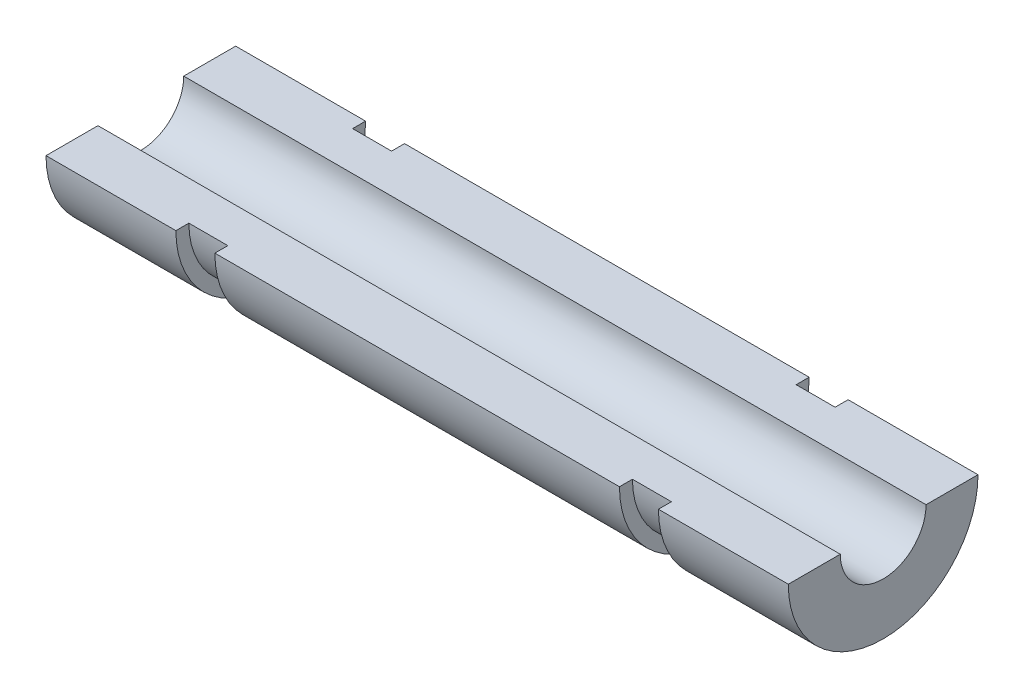
ISO-10303-21;
HEADER;
FILE_DESCRIPTION(('STEP AP214'),'2;1');
FILE_NAME('part.step','',(''),(''),'','','');
FILE_SCHEMA(('AUTOMOTIVE_DESIGN { 1 0 10303 214 1 1 1 1 }'));
ENDSEC;
DATA;
#1=APPLICATION_CONTEXT('core data for automotive mechanical design processes');
#2=APPLICATION_PROTOCOL_DEFINITION('international standard','automotive_design',2000,#1);
#3=PRODUCT_CONTEXT('',#1,'mechanical');
#4=PRODUCT('Part','Part','',(#3));
#5=PRODUCT_RELATED_PRODUCT_CATEGORY('part','',(#4));
#6=PRODUCT_DEFINITION_FORMATION('','',#4);
#7=PRODUCT_DEFINITION_CONTEXT('part definition',#1,'design');
#8=PRODUCT_DEFINITION('design','',#6,#7);
#9=PRODUCT_DEFINITION_SHAPE('','',#8);
#10=(LENGTH_UNIT() NAMED_UNIT(*) SI_UNIT(.MILLI.,.METRE.));
#11=(NAMED_UNIT(*) PLANE_ANGLE_UNIT() SI_UNIT($,.RADIAN.));
#12=(NAMED_UNIT(*) SI_UNIT($,.STERADIAN.) SOLID_ANGLE_UNIT());
#13=UNCERTAINTY_MEASURE_WITH_UNIT(LENGTH_MEASURE(1.E-05),#10,'distance_accuracy_value','');
#14=(GEOMETRIC_REPRESENTATION_CONTEXT(3) GLOBAL_UNCERTAINTY_ASSIGNED_CONTEXT((#13)) GLOBAL_UNIT_ASSIGNED_CONTEXT((#10,
#11,#12)) REPRESENTATION_CONTEXT('',''));
#15=CARTESIAN_POINT('',(0.,0.,0.));
#16=DIRECTION('',(0.,0.,1.));
#17=DIRECTION('',(1.,0.,0.));
#18=AXIS2_PLACEMENT_3D('',#15,#16,#17);
#19=CARTESIAN_POINT('',(-28.575,0.,-7.302));
#20=DIRECTION('',(-1.,0.,0.));
#21=DIRECTION('',(0.,0.,1.));
#22=AXIS2_PLACEMENT_3D('',#19,#20,#21);
#23=PLANE('',#22);
#24=CARTESIAN_POINT('',(-28.575,0.,0.));
#25=DIRECTION('',(-1.,0.,0.));
#26=DIRECTION('',(0.,0.,1.));
#27=AXIS2_PLACEMENT_3D('',#24,#25,#26);
#28=CIRCLE('',#27,3.302);
#29=CARTESIAN_POINT('',(-28.575,0.,-3.302));
#30=VERTEX_POINT('',#29);
#31=CARTESIAN_POINT('',(-28.575,0.,3.302));
#32=VERTEX_POINT('',#31);
#33=EDGE_CURVE('E11',#30,#32,#28,.T.);
#34=ORIENTED_EDGE('',*,*,#33,.F.);
#35=DIRECTION('',(0.,0.,-1.));
#36=VECTOR('',#35,1.);
#37=CARTESIAN_POINT('',(-28.575,0.,-7.302));
#38=LINE('',#37,#36);
#39=CARTESIAN_POINT('',(-28.575,0.,-7.302));
#40=VERTEX_POINT('',#39);
#41=EDGE_CURVE('E129',#30,#40,#38,.T.);
#42=ORIENTED_EDGE('',*,*,#41,.T.);
#43=CARTESIAN_POINT('',(-28.575,0.,0.));
#44=DIRECTION('',(-1.,0.,0.));
#45=DIRECTION('',(0.,0.,1.));
#46=AXIS2_PLACEMENT_3D('',#43,#44,#45);
#47=CIRCLE('',#46,7.302);
#48=CARTESIAN_POINT('',(-28.575,0.,7.302));
#49=VERTEX_POINT('',#48);
#50=EDGE_CURVE('E124',#40,#49,#47,.T.);
#51=ORIENTED_EDGE('',*,*,#50,.T.);
#52=DIRECTION('',(0.,0.,1.));
#53=VECTOR('',#52,1.);
#54=CARTESIAN_POINT('',(-28.575,0.,7.302));
#55=LINE('',#54,#53);
#56=EDGE_CURVE('E127',#32,#49,#55,.T.);
#57=ORIENTED_EDGE('',*,*,#56,.F.);
#58=EDGE_LOOP('',(#34,#42,#51,#57));
#59=FACE_BOUND('',#58,.T.);
#60=ADVANCED_FACE('F39',(#59),#23,.T.);
#61=CARTESIAN_POINT('',(-28.575,0.,0.));
#62=DIRECTION('',(-1.,0.,0.));
#63=DIRECTION('',(0.,0.,1.));
#64=AXIS2_PLACEMENT_3D('',#61,#62,#63);
#65=CYLINDRICAL_SURFACE('',#64,3.302);
#66=CARTESIAN_POINT('',(28.575,0.,0.));
#67=DIRECTION('',(-1.,0.,0.));
#68=DIRECTION('',(0.,0.,1.));
#69=AXIS2_PLACEMENT_3D('',#66,#67,#68);
#70=CIRCLE('',#69,3.302);
#71=CARTESIAN_POINT('',(28.575,0.,-3.302));
#72=VERTEX_POINT('',#71);
#73=CARTESIAN_POINT('',(28.575,0.,3.302));
#74=VERTEX_POINT('',#73);
#75=EDGE_CURVE('E48',#72,#74,#70,.T.);
#76=ORIENTED_EDGE('',*,*,#75,.F.);
#77=DIRECTION('',(-1.,0.,0.));
#78=VECTOR('',#77,1.);
#79=CARTESIAN_POINT('',(-28.575,0.,-3.302));
#80=LINE('',#79,#78);
#81=EDGE_CURVE('E135',#72,#30,#80,.T.);
#82=ORIENTED_EDGE('',*,*,#81,.T.);
#83=ORIENTED_EDGE('',*,*,#33,.T.);
#84=DIRECTION('',(-1.,0.,0.));
#85=VECTOR('',#84,1.);
#86=CARTESIAN_POINT('',(-28.575,0.,3.302));
#87=LINE('',#86,#85);
#88=EDGE_CURVE('E149',#74,#32,#87,.T.);
#89=ORIENTED_EDGE('',*,*,#88,.F.);
#90=EDGE_LOOP('',(#76,#82,#83,#89));
#91=FACE_BOUND('',#90,.T.);
#92=ADVANCED_FACE('F41',(#91),#65,.F.);
#93=CARTESIAN_POINT('',(28.575,0.,-7.302));
#94=DIRECTION('',(1.,0.,0.));
#95=DIRECTION('',(0.,0.,-1.));
#96=AXIS2_PLACEMENT_3D('',#93,#94,#95);
#97=PLANE('',#96);
#98=CARTESIAN_POINT('',(28.575,0.,0.));
#99=DIRECTION('',(-1.,0.,0.));
#100=DIRECTION('',(0.,0.,1.));
#101=AXIS2_PLACEMENT_3D('',#98,#99,#100);
#102=CIRCLE('',#101,7.302);
#103=CARTESIAN_POINT('',(28.575,0.,-7.302));
#104=VERTEX_POINT('',#103);
#105=CARTESIAN_POINT('',(28.575,0.,7.302));
#106=VERTEX_POINT('',#105);
#107=EDGE_CURVE('E253',#104,#106,#102,.T.);
#108=ORIENTED_EDGE('',*,*,#107,.F.);
#109=DIRECTION('',(0.,0.,1.));
#110=VECTOR('',#109,1.);
#111=CARTESIAN_POINT('',(28.575,0.,-7.302));
#112=LINE('',#111,#110);
#113=EDGE_CURVE('E225',#104,#72,#112,.T.);
#114=ORIENTED_EDGE('',*,*,#113,.T.);
#115=ORIENTED_EDGE('',*,*,#75,.T.);
#116=DIRECTION('',(0.,0.,-1.));
#117=VECTOR('',#116,1.);
#118=CARTESIAN_POINT('',(28.575,0.,7.302));
#119=LINE('',#118,#117);
#120=EDGE_CURVE('E183',#106,#74,#119,.T.);
#121=ORIENTED_EDGE('',*,*,#120,.F.);
#122=EDGE_LOOP('',(#108,#114,#115,#121));
#123=FACE_BOUND('',#122,.T.);
#124=ADVANCED_FACE('F258',(#123),#97,.T.);
#125=CARTESIAN_POINT('',(-28.575,0.,0.));
#126=DIRECTION('',(-1.,0.,0.));
#127=DIRECTION('',(0.,0.,1.));
#128=AXIS2_PLACEMENT_3D('',#125,#126,#127);
#129=CYLINDRICAL_SURFACE('',#128,7.302);
#130=CARTESIAN_POINT('',(18.575,0.,0.));
#131=DIRECTION('',(-1.,0.,0.));
#132=DIRECTION('',(0.,0.,1.));
#133=AXIS2_PLACEMENT_3D('',#130,#131,#132);
#134=CIRCLE('',#133,7.302);
#135=CARTESIAN_POINT('',(18.575,0.,-7.302));
#136=VERTEX_POINT('',#135);
#137=CARTESIAN_POINT('',(18.575,0.,7.302));
#138=VERTEX_POINT('',#137);
#139=EDGE_CURVE('E250',#136,#138,#134,.T.);
#140=ORIENTED_EDGE('',*,*,#139,.F.);
#141=DIRECTION('',(1.,0.,0.));
#142=VECTOR('',#141,1.);
#143=CARTESIAN_POINT('',(18.575,0.,-7.302));
#144=LINE('',#143,#142);
#145=EDGE_CURVE('E221',#136,#104,#144,.T.);
#146=ORIENTED_EDGE('',*,*,#145,.T.);
#147=ORIENTED_EDGE('',*,*,#107,.T.);
#148=DIRECTION('',(1.,0.,0.));
#149=VECTOR('',#148,1.);
#150=CARTESIAN_POINT('',(18.575,0.,7.302));
#151=LINE('',#150,#149);
#152=EDGE_CURVE('E179',#138,#106,#151,.T.);
#153=ORIENTED_EDGE('',*,*,#152,.F.);
#154=EDGE_LOOP('',(#140,#146,#147,#153));
#155=FACE_BOUND('',#154,.T.);
#156=ADVANCED_FACE('F293',(#155),#129,.T.);
#157=CARTESIAN_POINT('',(18.575,0.,-7.302));
#158=DIRECTION('',(-1.,0.,0.));
#159=DIRECTION('',(0.,0.,1.));
#160=AXIS2_PLACEMENT_3D('',#157,#158,#159);
#161=PLANE('',#160);
#162=CARTESIAN_POINT('',(18.575,0.,0.));
#163=DIRECTION('',(-1.,0.,0.));
#164=DIRECTION('',(0.,0.,1.));
#165=AXIS2_PLACEMENT_3D('',#162,#163,#164);
#166=CIRCLE('',#165,6.30199999999999);
#167=CARTESIAN_POINT('',(18.575,0.,-6.30199999999999));
#168=VERTEX_POINT('',#167);
#169=CARTESIAN_POINT('',(18.575,0.,6.30199999999999));
#170=VERTEX_POINT('',#169);
#171=EDGE_CURVE('E247',#168,#170,#166,.T.);
#172=ORIENTED_EDGE('',*,*,#171,.F.);
#173=DIRECTION('',(0.,0.,-1.));
#174=VECTOR('',#173,1.);
#175=CARTESIAN_POINT('',(18.575,0.,-7.302));
#176=LINE('',#175,#174);
#177=EDGE_CURVE('E217',#168,#136,#176,.T.);
#178=ORIENTED_EDGE('',*,*,#177,.T.);
#179=ORIENTED_EDGE('',*,*,#139,.T.);
#180=DIRECTION('',(0.,0.,1.));
#181=VECTOR('',#180,1.);
#182=CARTESIAN_POINT('',(18.575,0.,7.302));
#183=LINE('',#182,#181);
#184=EDGE_CURVE('E175',#170,#138,#183,.T.);
#185=ORIENTED_EDGE('',*,*,#184,.F.);
#186=EDGE_LOOP('',(#172,#178,#179,#185));
#187=FACE_BOUND('',#186,.T.);
#188=ADVANCED_FACE('F290',(#187),#161,.T.);
#189=CARTESIAN_POINT('',(-28.575,0.,0.));
#190=DIRECTION('',(-1.,0.,0.));
#191=DIRECTION('',(0.,0.,1.));
#192=AXIS2_PLACEMENT_3D('',#189,#190,#191);
#193=CYLINDRICAL_SURFACE('',#192,6.30199999999999);
#194=CARTESIAN_POINT('',(15.575,0.,0.));
#195=DIRECTION('',(-1.,0.,0.));
#196=DIRECTION('',(0.,0.,1.));
#197=AXIS2_PLACEMENT_3D('',#194,#195,#196);
#198=CIRCLE('',#197,6.30199999999999);
#199=CARTESIAN_POINT('',(15.575,0.,-6.30199999999999));
#200=VERTEX_POINT('',#199);
#201=CARTESIAN_POINT('',(15.575,0.,6.30199999999999));
#202=VERTEX_POINT('',#201);
#203=EDGE_CURVE('E244',#200,#202,#198,.T.);
#204=ORIENTED_EDGE('',*,*,#203,.F.);
#205=DIRECTION('',(1.,0.,0.));
#206=VECTOR('',#205,1.);
#207=CARTESIAN_POINT('',(18.575,0.,-6.30199999999999));
#208=LINE('',#207,#206);
#209=EDGE_CURVE('E213',#200,#168,#208,.T.);
#210=ORIENTED_EDGE('',*,*,#209,.T.);
#211=ORIENTED_EDGE('',*,*,#171,.T.);
#212=DIRECTION('',(1.,0.,0.));
#213=VECTOR('',#212,1.);
#214=CARTESIAN_POINT('',(18.575,0.,6.30199999999999));
#215=LINE('',#214,#213);
#216=EDGE_CURVE('E171',#202,#170,#215,.T.);
#217=ORIENTED_EDGE('',*,*,#216,.F.);
#218=EDGE_LOOP('',(#204,#210,#211,#217));
#219=FACE_BOUND('',#218,.T.);
#220=ADVANCED_FACE('F287',(#219),#193,.T.);
#221=CARTESIAN_POINT('',(15.575,0.,-7.302));
#222=DIRECTION('',(1.,0.,0.));
#223=DIRECTION('',(0.,0.,-1.));
#224=AXIS2_PLACEMENT_3D('',#221,#222,#223);
#225=PLANE('',#224);
#226=CARTESIAN_POINT('',(15.575,0.,0.));
#227=DIRECTION('',(-1.,0.,0.));
#228=DIRECTION('',(0.,0.,1.));
#229=AXIS2_PLACEMENT_3D('',#226,#227,#228);
#230=CIRCLE('',#229,7.302);
#231=CARTESIAN_POINT('',(15.575,0.,-7.302));
#232=VERTEX_POINT('',#231);
#233=CARTESIAN_POINT('',(15.575,0.,7.302));
#234=VERTEX_POINT('',#233);
#235=EDGE_CURVE('E241',#232,#234,#230,.T.);
#236=ORIENTED_EDGE('',*,*,#235,.F.);
#237=DIRECTION('',(0.,0.,1.));
#238=VECTOR('',#237,1.);
#239=CARTESIAN_POINT('',(15.575,0.,-7.302));
#240=LINE('',#239,#238);
#241=EDGE_CURVE('E209',#232,#200,#240,.T.);
#242=ORIENTED_EDGE('',*,*,#241,.T.);
#243=ORIENTED_EDGE('',*,*,#203,.T.);
#244=DIRECTION('',(0.,0.,-1.));
#245=VECTOR('',#244,1.);
#246=CARTESIAN_POINT('',(15.575,0.,7.302));
#247=LINE('',#246,#245);
#248=EDGE_CURVE('E167',#234,#202,#247,.T.);
#249=ORIENTED_EDGE('',*,*,#248,.F.);
#250=EDGE_LOOP('',(#236,#242,#243,#249));
#251=FACE_BOUND('',#250,.T.);
#252=ADVANCED_FACE('F282',(#251),#225,.T.);
#253=CARTESIAN_POINT('',(-28.575,0.,0.));
#254=DIRECTION('',(-1.,0.,0.));
#255=DIRECTION('',(0.,0.,1.));
#256=AXIS2_PLACEMENT_3D('',#253,#254,#255);
#257=CYLINDRICAL_SURFACE('',#256,7.302);
#258=CARTESIAN_POINT('',(-15.575,0.,0.));
#259=DIRECTION('',(-1.,0.,0.));
#260=DIRECTION('',(0.,0.,1.));
#261=AXIS2_PLACEMENT_3D('',#258,#259,#260);
#262=CIRCLE('',#261,7.302);
#263=CARTESIAN_POINT('',(-15.575,0.,-7.302));
#264=VERTEX_POINT('',#263);
#265=CARTESIAN_POINT('',(-15.575,0.,7.302));
#266=VERTEX_POINT('',#265);
#267=EDGE_CURVE('E238',#264,#266,#262,.T.);
#268=ORIENTED_EDGE('',*,*,#267,.F.);
#269=DIRECTION('',(1.,0.,0.));
#270=VECTOR('',#269,1.);
#271=CARTESIAN_POINT('',(-15.575,0.,-7.302));
#272=LINE('',#271,#270);
#273=EDGE_CURVE('E205',#264,#232,#272,.T.);
#274=ORIENTED_EDGE('',*,*,#273,.T.);
#275=ORIENTED_EDGE('',*,*,#235,.T.);
#276=DIRECTION('',(1.,0.,0.));
#277=VECTOR('',#276,1.);
#278=CARTESIAN_POINT('',(-15.575,0.,7.302));
#279=LINE('',#278,#277);
#280=EDGE_CURVE('E163',#266,#234,#279,.T.);
#281=ORIENTED_EDGE('',*,*,#280,.F.);
#282=EDGE_LOOP('',(#268,#274,#275,#281));
#283=FACE_BOUND('',#282,.T.);
#284=ADVANCED_FACE('F279',(#283),#257,.T.);
#285=CARTESIAN_POINT('',(-15.575,0.,-7.302));
#286=DIRECTION('',(-1.,0.,0.));
#287=DIRECTION('',(0.,0.,1.));
#288=AXIS2_PLACEMENT_3D('',#285,#286,#287);
#289=PLANE('',#288);
#290=CARTESIAN_POINT('',(-15.575,0.,0.));
#291=DIRECTION('',(-1.,0.,0.));
#292=DIRECTION('',(0.,0.,1.));
#293=AXIS2_PLACEMENT_3D('',#290,#291,#292);
#294=CIRCLE('',#293,6.30199999999999);
#295=CARTESIAN_POINT('',(-15.575,0.,-6.30199999999999));
#296=VERTEX_POINT('',#295);
#297=CARTESIAN_POINT('',(-15.575,0.,6.30199999999999));
#298=VERTEX_POINT('',#297);
#299=EDGE_CURVE('E235',#296,#298,#294,.T.);
#300=ORIENTED_EDGE('',*,*,#299,.F.);
#301=DIRECTION('',(0.,0.,-1.));
#302=VECTOR('',#301,1.);
#303=CARTESIAN_POINT('',(-15.575,0.,-7.302));
#304=LINE('',#303,#302);
#305=EDGE_CURVE('E201',#296,#264,#304,.T.);
#306=ORIENTED_EDGE('',*,*,#305,.T.);
#307=ORIENTED_EDGE('',*,*,#267,.T.);
#308=DIRECTION('',(0.,0.,1.));
#309=VECTOR('',#308,1.);
#310=CARTESIAN_POINT('',(-15.575,0.,7.302));
#311=LINE('',#310,#309);
#312=EDGE_CURVE('E159',#298,#266,#311,.T.);
#313=ORIENTED_EDGE('',*,*,#312,.F.);
#314=EDGE_LOOP('',(#300,#306,#307,#313));
#315=FACE_BOUND('',#314,.T.);
#316=ADVANCED_FACE('F274',(#315),#289,.T.);
#317=CARTESIAN_POINT('',(-28.575,0.,0.));
#318=DIRECTION('',(-1.,0.,0.));
#319=DIRECTION('',(0.,0.,1.));
#320=AXIS2_PLACEMENT_3D('',#317,#318,#319);
#321=CYLINDRICAL_SURFACE('',#320,6.30199999999999);
#322=CARTESIAN_POINT('',(-18.575,0.,0.));
#323=DIRECTION('',(-1.,0.,0.));
#324=DIRECTION('',(0.,0.,1.));
#325=AXIS2_PLACEMENT_3D('',#322,#323,#324);
#326=CIRCLE('',#325,6.30199999999999);
#327=CARTESIAN_POINT('',(-18.575,0.,-6.30199999999999));
#328=VERTEX_POINT('',#327);
#329=CARTESIAN_POINT('',(-18.575,0.,6.30199999999999));
#330=VERTEX_POINT('',#329);
#331=EDGE_CURVE('E232',#328,#330,#326,.T.);
#332=ORIENTED_EDGE('',*,*,#331,.F.);
#333=DIRECTION('',(1.,0.,0.));
#334=VECTOR('',#333,1.);
#335=CARTESIAN_POINT('',(-18.575,0.,-6.30199999999999));
#336=LINE('',#335,#334);
#337=EDGE_CURVE('E197',#328,#296,#336,.T.);
#338=ORIENTED_EDGE('',*,*,#337,.T.);
#339=ORIENTED_EDGE('',*,*,#299,.T.);
#340=DIRECTION('',(1.,0.,0.));
#341=VECTOR('',#340,1.);
#342=CARTESIAN_POINT('',(-18.575,0.,6.30199999999999));
#343=LINE('',#342,#341);
#344=EDGE_CURVE('E155',#330,#298,#343,.T.);
#345=ORIENTED_EDGE('',*,*,#344,.F.);
#346=EDGE_LOOP('',(#332,#338,#339,#345));
#347=FACE_BOUND('',#346,.T.);
#348=ADVANCED_FACE('F272',(#347),#321,.T.);
#349=CARTESIAN_POINT('',(-18.575,0.,-7.302));
#350=DIRECTION('',(1.,0.,0.));
#351=DIRECTION('',(0.,0.,-1.));
#352=AXIS2_PLACEMENT_3D('',#349,#350,#351);
#353=PLANE('',#352);
#354=CARTESIAN_POINT('',(-18.575,0.,0.));
#355=DIRECTION('',(-1.,0.,0.));
#356=DIRECTION('',(0.,0.,1.));
#357=AXIS2_PLACEMENT_3D('',#354,#355,#356);
#358=CIRCLE('',#357,7.302);
#359=CARTESIAN_POINT('',(-18.575,0.,-7.302));
#360=VERTEX_POINT('',#359);
#361=CARTESIAN_POINT('',(-18.575,0.,7.302));
#362=VERTEX_POINT('',#361);
#363=EDGE_CURVE('E134',#360,#362,#358,.T.);
#364=ORIENTED_EDGE('',*,*,#363,.F.);
#365=DIRECTION('',(0.,0.,1.));
#366=VECTOR('',#365,1.);
#367=CARTESIAN_POINT('',(-18.575,0.,-7.302));
#368=LINE('',#367,#366);
#369=EDGE_CURVE('E193',#360,#328,#368,.T.);
#370=ORIENTED_EDGE('',*,*,#369,.T.);
#371=ORIENTED_EDGE('',*,*,#331,.T.);
#372=DIRECTION('',(0.,0.,-1.));
#373=VECTOR('',#372,1.);
#374=CARTESIAN_POINT('',(-18.575,0.,7.302));
#375=LINE('',#374,#373);
#376=EDGE_CURVE('E144',#362,#330,#375,.T.);
#377=ORIENTED_EDGE('',*,*,#376,.F.);
#378=EDGE_LOOP('',(#364,#370,#371,#377));
#379=FACE_BOUND('',#378,.T.);
#380=ADVANCED_FACE('F268',(#379),#353,.T.);
#381=CARTESIAN_POINT('',(-28.575,0.,0.));
#382=DIRECTION('',(-1.,0.,0.));
#383=DIRECTION('',(0.,0.,1.));
#384=AXIS2_PLACEMENT_3D('',#381,#382,#383);
#385=CYLINDRICAL_SURFACE('',#384,7.302);
#386=DIRECTION('',(1.,0.,0.));
#387=VECTOR('',#386,1.);
#388=CARTESIAN_POINT('',(-28.575,0.,-7.302));
#389=LINE('',#388,#387);
#390=EDGE_CURVE('E190',#40,#360,#389,.T.);
#391=ORIENTED_EDGE('',*,*,#390,.T.);
#392=ORIENTED_EDGE('',*,*,#363,.T.);
#393=DIRECTION('',(1.,0.,0.));
#394=VECTOR('',#393,1.);
#395=CARTESIAN_POINT('',(-28.575,0.,7.302));
#396=LINE('',#395,#394);
#397=EDGE_CURVE('E138',#49,#362,#396,.T.);
#398=ORIENTED_EDGE('',*,*,#397,.F.);
#399=ORIENTED_EDGE('',*,*,#50,.F.);
#400=EDGE_LOOP('',(#391,#392,#398,#399));
#401=FACE_BOUND('',#400,.T.);
#402=ADVANCED_FACE('F139',(#401),#385,.T.);
#403=CARTESIAN_POINT('',(0.,0.,0.));
#404=DIRECTION('',(0.,1.,0.));
#405=DIRECTION('',(0.,0.,1.));
#406=AXIS2_PLACEMENT_3D('',#403,#404,#405);
#407=PLANE('',#406);
#408=ORIENTED_EDGE('',*,*,#41,.F.);
#409=ORIENTED_EDGE('',*,*,#81,.F.);
#410=ORIENTED_EDGE('',*,*,#113,.F.);
#411=ORIENTED_EDGE('',*,*,#145,.F.);
#412=ORIENTED_EDGE('',*,*,#177,.F.);
#413=ORIENTED_EDGE('',*,*,#209,.F.);
#414=ORIENTED_EDGE('',*,*,#241,.F.);
#415=ORIENTED_EDGE('',*,*,#273,.F.);
#416=ORIENTED_EDGE('',*,*,#305,.F.);
#417=ORIENTED_EDGE('',*,*,#337,.F.);
#418=ORIENTED_EDGE('',*,*,#369,.F.);
#419=ORIENTED_EDGE('',*,*,#390,.F.);
#420=EDGE_LOOP('',(#408,#409,#410,#411,#412,#413,#414,#415,#416,#417,#418,#419));
#421=FACE_BOUND('',#420,.T.);
#422=ADVANCED_FACE('F263',(#421),#407,.T.);
#423=CARTESIAN_POINT('',(0.,0.,0.));
#424=DIRECTION('',(0.,-1.,0.));
#425=DIRECTION('',(0.,0.,-1.));
#426=AXIS2_PLACEMENT_3D('',#423,#424,#425);
#427=PLANE('',#426);
#428=ORIENTED_EDGE('',*,*,#56,.T.);
#429=ORIENTED_EDGE('',*,*,#397,.T.);
#430=ORIENTED_EDGE('',*,*,#376,.T.);
#431=ORIENTED_EDGE('',*,*,#344,.T.);
#432=ORIENTED_EDGE('',*,*,#312,.T.);
#433=ORIENTED_EDGE('',*,*,#280,.T.);
#434=ORIENTED_EDGE('',*,*,#248,.T.);
#435=ORIENTED_EDGE('',*,*,#216,.T.);
#436=ORIENTED_EDGE('',*,*,#184,.T.);
#437=ORIENTED_EDGE('',*,*,#152,.T.);
#438=ORIENTED_EDGE('',*,*,#120,.T.);
#439=ORIENTED_EDGE('',*,*,#88,.T.);
#440=EDGE_LOOP('',(#428,#429,#430,#431,#432,#433,#434,#435,#436,#437,#438,#439));
#441=FACE_BOUND('',#440,.T.);
#442=ADVANCED_FACE('F147',(#441),#427,.F.);
#443=CLOSED_SHELL('',(#60,#92,#124,#156,#188,#220,#252,#284,#316,#348,#380,#402,#422,#442));
#444=MANIFOLD_SOLID_BREP('B2',#443);
#445=ADVANCED_BREP_SHAPE_REPRESENTATION('',(#18,#444),#14);
#446=SHAPE_DEFINITION_REPRESENTATION(#9,#445);
ENDSEC;
END-ISO-10303-21;
